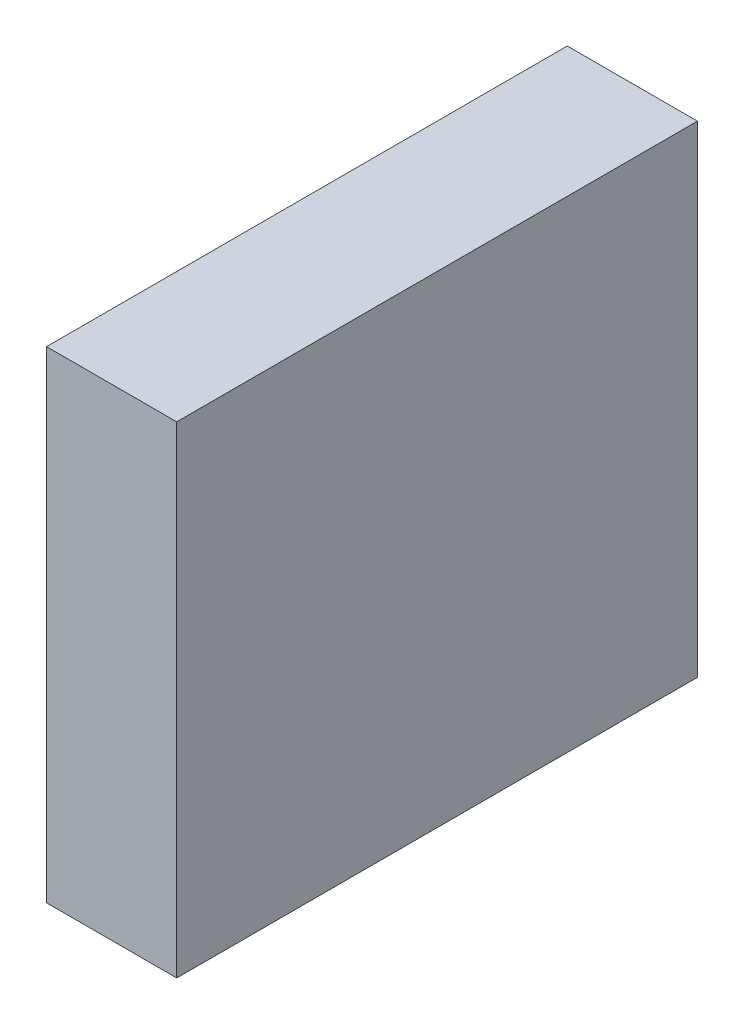
ISO-10303-21;
HEADER;
FILE_DESCRIPTION(('STEP AP214'),'2;1');
FILE_NAME('part.step','',(''),(''),'','','');
FILE_SCHEMA(('AUTOMOTIVE_DESIGN { 1 0 10303 214 1 1 1 1 }'));
ENDSEC;
DATA;
#1=APPLICATION_CONTEXT('core data for automotive mechanical design processes');
#2=APPLICATION_PROTOCOL_DEFINITION('international standard','automotive_design',2000,#1);
#3=PRODUCT_CONTEXT('',#1,'mechanical');
#4=PRODUCT('Part','Part','',(#3));
#5=PRODUCT_RELATED_PRODUCT_CATEGORY('part','',(#4));
#6=PRODUCT_DEFINITION_FORMATION('','',#4);
#7=PRODUCT_DEFINITION_CONTEXT('part definition',#1,'design');
#8=PRODUCT_DEFINITION('design','',#6,#7);
#9=PRODUCT_DEFINITION_SHAPE('','',#8);
#10=(LENGTH_UNIT() NAMED_UNIT(*) SI_UNIT(.MILLI.,.METRE.));
#11=(NAMED_UNIT(*) PLANE_ANGLE_UNIT() SI_UNIT($,.RADIAN.));
#12=(NAMED_UNIT(*) SI_UNIT($,.STERADIAN.) SOLID_ANGLE_UNIT());
#13=UNCERTAINTY_MEASURE_WITH_UNIT(LENGTH_MEASURE(1.E-05),#10,'distance_accuracy_value','');
#14=(GEOMETRIC_REPRESENTATION_CONTEXT(3) GLOBAL_UNCERTAINTY_ASSIGNED_CONTEXT((#13)) GLOBAL_UNIT_ASSIGNED_CONTEXT((#10,
#11,#12)) REPRESENTATION_CONTEXT('',''));
#15=CARTESIAN_POINT('',(0.,0.,0.));
#16=DIRECTION('',(0.,0.,1.));
#17=DIRECTION('',(1.,0.,0.));
#18=AXIS2_PLACEMENT_3D('',#15,#16,#17);
#19=CARTESIAN_POINT('',(10.,0.,0.));
#20=DIRECTION('',(0.,0.,-1.));
#21=DIRECTION('',(-1.,0.,0.));
#22=AXIS2_PLACEMENT_3D('',#19,#20,#21);
#23=PLANE('',#22);
#24=DIRECTION('',(0.,-1.,0.));
#25=VECTOR('',#24,1.);
#26=CARTESIAN_POINT('',(0.,0.,0.));
#27=LINE('',#26,#25);
#28=CARTESIAN_POINT('',(0.,37.,0.));
#29=VERTEX_POINT('',#28);
#30=CARTESIAN_POINT('',(0.,0.,0.));
#31=VERTEX_POINT('',#30);
#32=EDGE_CURVE('E105',#29,#31,#27,.T.);
#33=ORIENTED_EDGE('',*,*,#32,.T.);
#34=DIRECTION('',(-1.,0.,0.));
#35=VECTOR('',#34,1.);
#36=CARTESIAN_POINT('',(10.,0.,0.));
#37=LINE('',#36,#35);
#38=CARTESIAN_POINT('',(10.,0.,0.));
#39=VERTEX_POINT('',#38);
#40=EDGE_CURVE('E11',#39,#31,#37,.T.);
#41=ORIENTED_EDGE('',*,*,#40,.F.);
#42=DIRECTION('',(0.,-1.,0.));
#43=VECTOR('',#42,1.);
#44=CARTESIAN_POINT('',(10.,0.,0.));
#45=LINE('',#44,#43);
#46=CARTESIAN_POINT('',(10.,37.,0.));
#47=VERTEX_POINT('',#46);
#48=EDGE_CURVE('E89',#47,#39,#45,.T.);
#49=ORIENTED_EDGE('',*,*,#48,.F.);
#50=DIRECTION('',(-1.,0.,0.));
#51=VECTOR('',#50,1.);
#52=CARTESIAN_POINT('',(10.,37.,0.));
#53=LINE('',#52,#51);
#54=EDGE_CURVE('E97',#47,#29,#53,.T.);
#55=ORIENTED_EDGE('',*,*,#54,.T.);
#56=EDGE_LOOP('',(#33,#41,#49,#55));
#57=FACE_BOUND('',#56,.T.);
#58=ADVANCED_FACE('F39',(#57),#23,.F.);
#59=CARTESIAN_POINT('',(10.,0.,0.));
#60=DIRECTION('',(0.,1.,0.));
#61=DIRECTION('',(0.,0.,1.));
#62=AXIS2_PLACEMENT_3D('',#59,#60,#61);
#63=PLANE('',#62);
#64=DIRECTION('',(0.,0.,-1.));
#65=VECTOR('',#64,1.);
#66=CARTESIAN_POINT('',(0.,0.,0.));
#67=LINE('',#66,#65);
#68=CARTESIAN_POINT('',(0.,0.,-40.));
#69=VERTEX_POINT('',#68);
#70=EDGE_CURVE('E92',#31,#69,#67,.T.);
#71=ORIENTED_EDGE('',*,*,#70,.T.);
#72=DIRECTION('',(-1.,0.,0.));
#73=VECTOR('',#72,1.);
#74=CARTESIAN_POINT('',(10.,0.,-40.));
#75=LINE('',#74,#73);
#76=CARTESIAN_POINT('',(10.,0.,-40.));
#77=VERTEX_POINT('',#76);
#78=EDGE_CURVE('E50',#77,#69,#75,.T.);
#79=ORIENTED_EDGE('',*,*,#78,.F.);
#80=DIRECTION('',(0.,0.,-1.));
#81=VECTOR('',#80,1.);
#82=CARTESIAN_POINT('',(10.,0.,0.));
#83=LINE('',#82,#81);
#84=EDGE_CURVE('E82',#39,#77,#83,.T.);
#85=ORIENTED_EDGE('',*,*,#84,.F.);
#86=ORIENTED_EDGE('',*,*,#40,.T.);
#87=EDGE_LOOP('',(#71,#79,#85,#86));
#88=FACE_BOUND('',#87,.T.);
#89=ADVANCED_FACE('F93',(#88),#63,.F.);
#90=CARTESIAN_POINT('',(10.,0.,-40.));
#91=DIRECTION('',(0.,0.,1.));
#92=DIRECTION('',(1.,0.,0.));
#93=AXIS2_PLACEMENT_3D('',#90,#91,#92);
#94=PLANE('',#93);
#95=DIRECTION('',(0.,1.,0.));
#96=VECTOR('',#95,1.);
#97=CARTESIAN_POINT('',(0.,0.,-40.));
#98=LINE('',#97,#96);
#99=CARTESIAN_POINT('',(0.,37.,-40.));
#100=VERTEX_POINT('',#99);
#101=EDGE_CURVE('E72',#69,#100,#98,.T.);
#102=ORIENTED_EDGE('',*,*,#101,.T.);
#103=DIRECTION('',(-1.,0.,0.));
#104=VECTOR('',#103,1.);
#105=CARTESIAN_POINT('',(10.,37.,-40.));
#106=LINE('',#105,#104);
#107=CARTESIAN_POINT('',(10.,37.,-40.));
#108=VERTEX_POINT('',#107);
#109=EDGE_CURVE('E94',#108,#100,#106,.T.);
#110=ORIENTED_EDGE('',*,*,#109,.F.);
#111=DIRECTION('',(0.,1.,0.));
#112=VECTOR('',#111,1.);
#113=CARTESIAN_POINT('',(10.,0.,-40.));
#114=LINE('',#113,#112);
#115=EDGE_CURVE('E88',#77,#108,#114,.T.);
#116=ORIENTED_EDGE('',*,*,#115,.F.);
#117=ORIENTED_EDGE('',*,*,#78,.T.);
#118=EDGE_LOOP('',(#102,#110,#116,#117));
#119=FACE_BOUND('',#118,.T.);
#120=ADVANCED_FACE('F96',(#119),#94,.F.);
#121=CARTESIAN_POINT('',(10.,37.,0.));
#122=DIRECTION('',(0.,-1.,0.));
#123=DIRECTION('',(0.,0.,-1.));
#124=AXIS2_PLACEMENT_3D('',#121,#122,#123);
#125=PLANE('',#124);
#126=DIRECTION('',(0.,0.,1.));
#127=VECTOR('',#126,1.);
#128=CARTESIAN_POINT('',(0.,37.,0.));
#129=LINE('',#128,#127);
#130=EDGE_CURVE('E76',#100,#29,#129,.T.);
#131=ORIENTED_EDGE('',*,*,#130,.T.);
#132=ORIENTED_EDGE('',*,*,#54,.F.);
#133=DIRECTION('',(0.,0.,1.));
#134=VECTOR('',#133,1.);
#135=CARTESIAN_POINT('',(10.,37.,0.));
#136=LINE('',#135,#134);
#137=EDGE_CURVE('E54',#108,#47,#136,.T.);
#138=ORIENTED_EDGE('',*,*,#137,.F.);
#139=ORIENTED_EDGE('',*,*,#109,.T.);
#140=EDGE_LOOP('',(#131,#132,#138,#139));
#141=FACE_BOUND('',#140,.T.);
#142=ADVANCED_FACE('F108',(#141),#125,.F.);
#143=CARTESIAN_POINT('',(10.,0.,0.));
#144=DIRECTION('',(-1.,0.,0.));
#145=DIRECTION('',(0.,0.,1.));
#146=AXIS2_PLACEMENT_3D('',#143,#144,#145);
#147=PLANE('',#146);
#148=ORIENTED_EDGE('',*,*,#48,.T.);
#149=ORIENTED_EDGE('',*,*,#84,.T.);
#150=ORIENTED_EDGE('',*,*,#115,.T.);
#151=ORIENTED_EDGE('',*,*,#137,.T.);
#152=EDGE_LOOP('',(#148,#149,#150,#151));
#153=FACE_BOUND('',#152,.T.);
#154=ADVANCED_FACE('F86',(#153),#147,.F.);
#155=CARTESIAN_POINT('',(0.,0.,0.));
#156=DIRECTION('',(-1.,0.,0.));
#157=DIRECTION('',(0.,0.,1.));
#158=AXIS2_PLACEMENT_3D('',#155,#156,#157);
#159=PLANE('',#158);
#160=ORIENTED_EDGE('',*,*,#32,.F.);
#161=ORIENTED_EDGE('',*,*,#130,.F.);
#162=ORIENTED_EDGE('',*,*,#101,.F.);
#163=ORIENTED_EDGE('',*,*,#70,.F.);
#164=EDGE_LOOP('',(#160,#161,#162,#163));
#165=FACE_BOUND('',#164,.T.);
#166=ADVANCED_FACE('F115',(#165),#159,.T.);
#167=CLOSED_SHELL('',(#58,#89,#120,#142,#154,#166));
#168=MANIFOLD_SOLID_BREP('B2',#167);
#169=ADVANCED_BREP_SHAPE_REPRESENTATION('',(#18,#168),#14);
#170=SHAPE_DEFINITION_REPRESENTATION(#9,#169);
ENDSEC;
END-ISO-10303-21;
